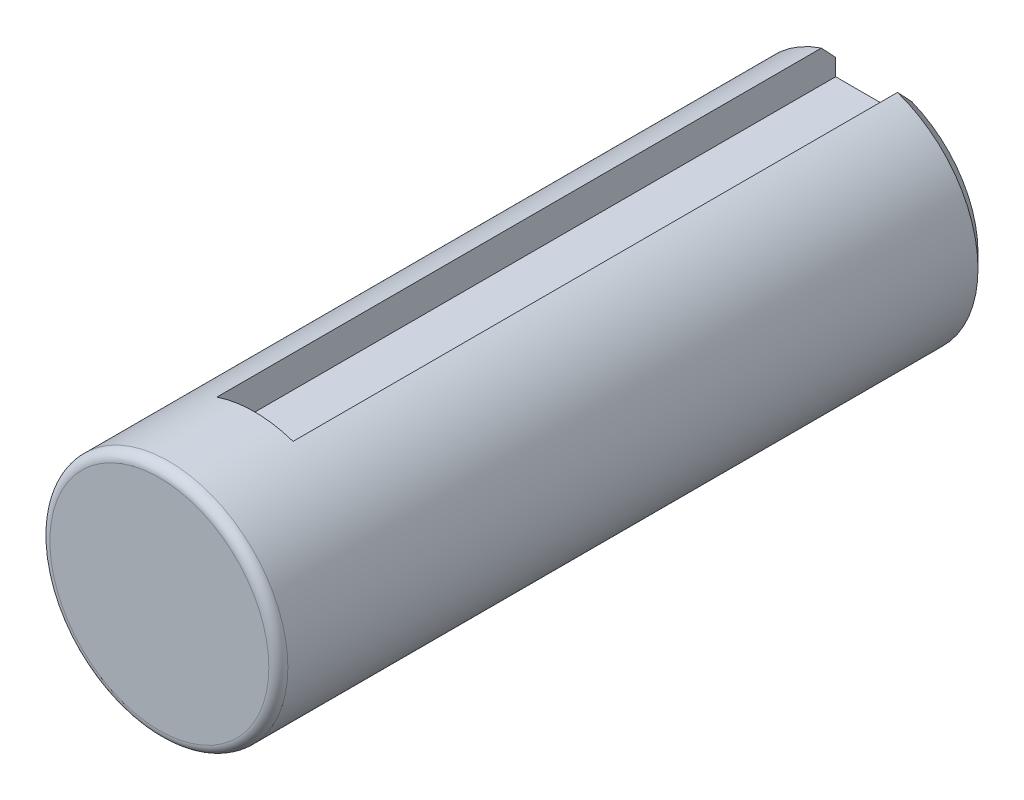
ISO-10303-21;
HEADER;
FILE_DESCRIPTION(('STEP AP214'),'2;1');
FILE_NAME('part.step','',(''),(''),'','','');
FILE_SCHEMA(('AUTOMOTIVE_DESIGN { 1 0 10303 214 1 1 1 1 }'));
ENDSEC;
DATA;
#1=APPLICATION_CONTEXT('core data for automotive mechanical design processes');
#2=APPLICATION_PROTOCOL_DEFINITION('international standard','automotive_design',2000,#1);
#3=PRODUCT_CONTEXT('',#1,'mechanical');
#4=PRODUCT('Part','Part','',(#3));
#5=PRODUCT_RELATED_PRODUCT_CATEGORY('part','',(#4));
#6=PRODUCT_DEFINITION_FORMATION('','',#4);
#7=PRODUCT_DEFINITION_CONTEXT('part definition',#1,'design');
#8=PRODUCT_DEFINITION('design','',#6,#7);
#9=PRODUCT_DEFINITION_SHAPE('','',#8);
#10=(LENGTH_UNIT() NAMED_UNIT(*) SI_UNIT(.MILLI.,.METRE.));
#11=(NAMED_UNIT(*) PLANE_ANGLE_UNIT() SI_UNIT($,.RADIAN.));
#12=(NAMED_UNIT(*) SI_UNIT($,.STERADIAN.) SOLID_ANGLE_UNIT());
#13=UNCERTAINTY_MEASURE_WITH_UNIT(LENGTH_MEASURE(1.E-05),#10,'distance_accuracy_value','');
#14=(GEOMETRIC_REPRESENTATION_CONTEXT(3) GLOBAL_UNCERTAINTY_ASSIGNED_CONTEXT((#13)) GLOBAL_UNIT_ASSIGNED_CONTEXT((#10,
#11,#12)) REPRESENTATION_CONTEXT('',''));
#15=CARTESIAN_POINT('',(0.,0.,0.));
#16=DIRECTION('',(0.,0.,1.));
#17=DIRECTION('',(1.,0.,0.));
#18=AXIS2_PLACEMENT_3D('',#15,#16,#17);
#19=CARTESIAN_POINT('',(0.,0.,75.));
#20=DIRECTION('',(0.,0.,-1.));
#21=DIRECTION('',(-1.,0.,0.));
#22=AXIS2_PLACEMENT_3D('',#19,#20,#21);
#23=CYLINDRICAL_SURFACE('',#22,12.5);
#24=CARTESIAN_POINT('',(0.,0.,74.));
#25=DIRECTION('',(0.,0.,1.));
#26=DIRECTION('',(1.,0.,0.));
#27=AXIS2_PLACEMENT_3D('',#24,#25,#26);
#28=CIRCLE('',#27,12.5);
#29=CARTESIAN_POINT('',(12.5,0.,74.));
#30=VERTEX_POINT('',#29);
#31=EDGE_CURVE('E11',#30,#30,#28,.F.);
#32=ORIENTED_EDGE('',*,*,#31,.T.);
#33=EDGE_LOOP('',(#32));
#34=FACE_BOUND('',#33,.T.);
#35=DIRECTION('',(0.,0.,-1.));
#36=VECTOR('',#35,1.);
#37=CARTESIAN_POINT('',(-3.95410501543583,11.8581218380866,65.));
#38=LINE('',#37,#36);
#39=CARTESIAN_POINT('',(-3.95410501543583,11.8581218380866,65.));
#40=VERTEX_POINT('',#39);
#41=CARTESIAN_POINT('',(-3.95410501543583,11.8581218380866,1.50000000000002));
#42=VERTEX_POINT('',#41);
#43=EDGE_CURVE('E103',#40,#42,#38,.T.);
#44=ORIENTED_EDGE('',*,*,#43,.T.);
#45=CARTESIAN_POINT('',(0.,0.,1.50000000000002));
#46=DIRECTION('',(0.,0.,1.));
#47=DIRECTION('',(1.,0.,0.));
#48=AXIS2_PLACEMENT_3D('',#45,#46,#47);
#49=CIRCLE('',#48,12.5);
#50=CARTESIAN_POINT('',(4.04589498456417,11.8271185744406,1.50000000000002));
#51=VERTEX_POINT('',#50);
#52=EDGE_CURVE('E129',#42,#51,#49,.T.);
#53=ORIENTED_EDGE('',*,*,#52,.T.);
#54=DIRECTION('',(0.,0.,-1.));
#55=VECTOR('',#54,1.);
#56=CARTESIAN_POINT('',(4.04589498456417,11.8271185744406,65.));
#57=LINE('',#56,#55);
#58=CARTESIAN_POINT('',(4.04589498456417,11.8271185744406,65.));
#59=VERTEX_POINT('',#58);
#60=EDGE_CURVE('E111',#59,#51,#57,.T.);
#61=ORIENTED_EDGE('',*,*,#60,.F.);
#62=CARTESIAN_POINT('',(0.,0.,65.));
#63=DIRECTION('',(0.,0.,-1.));
#64=DIRECTION('',(-1.,0.,0.));
#65=AXIS2_PLACEMENT_3D('',#62,#63,#64);
#66=CIRCLE('',#65,12.5);
#67=EDGE_CURVE('E96',#40,#59,#66,.T.);
#68=ORIENTED_EDGE('',*,*,#67,.F.);
#69=EDGE_LOOP('',(#44,#53,#61,#68));
#70=FACE_BOUND('',#69,.T.);
#71=ADVANCED_FACE('F39',(#34,#70),#23,.T.);
#72=CARTESIAN_POINT('',(0.,0.,75.));
#73=DIRECTION('',(0.,0.,1.));
#74=DIRECTION('',(1.,0.,0.));
#75=AXIS2_PLACEMENT_3D('',#72,#73,#74);
#76=PLANE('',#75);
#77=CARTESIAN_POINT('',(0.,0.,75.));
#78=DIRECTION('',(0.,0.,1.));
#79=DIRECTION('',(1.,0.,0.));
#80=AXIS2_PLACEMENT_3D('',#77,#78,#79);
#81=CIRCLE('',#80,11.5);
#82=CARTESIAN_POINT('',(11.5,0.,75.));
#83=VERTEX_POINT('',#82);
#84=EDGE_CURVE('E47',#83,#83,#81,.T.);
#85=ORIENTED_EDGE('',*,*,#84,.T.);
#86=EDGE_LOOP('',(#85));
#87=FACE_BOUND('',#86,.T.);
#88=ADVANCED_FACE('F170',(#87),#76,.T.);
#89=CARTESIAN_POINT('',(0.,0.,0.));
#90=DIRECTION('',(0.,0.,1.));
#91=DIRECTION('',(1.,0.,0.));
#92=AXIS2_PLACEMENT_3D('',#89,#90,#91);
#93=PLANE('',#92);
#94=DIRECTION('',(0.,-1.,0.));
#95=VECTOR('',#94,1.);
#96=CARTESIAN_POINT('',(4.04589498456417,0.,0.));
#97=LINE('',#96,#95);
#98=CARTESIAN_POINT('',(4.04589498456417,10.2289165493652,0.));
#99=VERTEX_POINT('',#98);
#100=CARTESIAN_POINT('',(4.04589498456417,8.5,0.));
#101=VERTEX_POINT('',#100);
#102=EDGE_CURVE('E100',#99,#101,#97,.T.);
#103=ORIENTED_EDGE('',*,*,#102,.F.);
#104=CARTESIAN_POINT('',(0.,0.,0.));
#105=DIRECTION('',(0.,0.,1.));
#106=DIRECTION('',(1.,0.,0.));
#107=AXIS2_PLACEMENT_3D('',#104,#105,#106);
#108=CIRCLE('',#107,11.);
#109=CARTESIAN_POINT('',(-3.95410501543583,10.2647480985607,0.));
#110=VERTEX_POINT('',#109);
#111=EDGE_CURVE('E141',#99,#110,#108,.F.);
#112=ORIENTED_EDGE('',*,*,#111,.T.);
#113=DIRECTION('',(0.,1.,0.));
#114=VECTOR('',#113,1.);
#115=CARTESIAN_POINT('',(-3.95410501543583,0.,0.));
#116=LINE('',#115,#114);
#117=CARTESIAN_POINT('',(-3.95410501543583,8.5,0.));
#118=VERTEX_POINT('',#117);
#119=EDGE_CURVE('E123',#118,#110,#116,.T.);
#120=ORIENTED_EDGE('',*,*,#119,.F.);
#121=DIRECTION('',(-1.,0.,0.));
#122=VECTOR('',#121,1.);
#123=CARTESIAN_POINT('',(0.,8.5,0.));
#124=LINE('',#123,#122);
#125=EDGE_CURVE('E120',#101,#118,#124,.T.);
#126=ORIENTED_EDGE('',*,*,#125,.F.);
#127=EDGE_LOOP('',(#103,#112,#120,#126));
#128=FACE_BOUND('',#127,.T.);
#129=ADVANCED_FACE('F185',(#128),#93,.F.);
#130=CARTESIAN_POINT('',(0.,8.5,65.));
#131=DIRECTION('',(0.,-1.,0.));
#132=DIRECTION('',(0.,0.,-1.));
#133=AXIS2_PLACEMENT_3D('',#130,#131,#132);
#134=PLANE('',#133);
#135=DIRECTION('',(0.,0.,-1.));
#136=VECTOR('',#135,1.);
#137=CARTESIAN_POINT('',(-3.95410501543583,8.5,65.));
#138=LINE('',#137,#136);
#139=CARTESIAN_POINT('',(-3.95410501543583,8.5,62.));
#140=VERTEX_POINT('',#139);
#141=EDGE_CURVE('E112',#140,#118,#138,.T.);
#142=ORIENTED_EDGE('',*,*,#141,.F.);
#143=DIRECTION('',(-1.,0.,0.));
#144=VECTOR('',#143,1.);
#145=CARTESIAN_POINT('',(0.,8.5,62.));
#146=LINE('',#145,#144);
#147=CARTESIAN_POINT('',(4.04589498456417,8.5,62.));
#148=VERTEX_POINT('',#147);
#149=EDGE_CURVE('E54',#140,#148,#146,.F.);
#150=ORIENTED_EDGE('',*,*,#149,.T.);
#151=DIRECTION('',(0.,0.,-1.));
#152=VECTOR('',#151,1.);
#153=CARTESIAN_POINT('',(4.04589498456417,8.5,65.));
#154=LINE('',#153,#152);
#155=EDGE_CURVE('E127',#148,#101,#154,.T.);
#156=ORIENTED_EDGE('',*,*,#155,.T.);
#157=ORIENTED_EDGE('',*,*,#125,.T.);
#158=EDGE_LOOP('',(#142,#150,#156,#157));
#159=FACE_BOUND('',#158,.T.);
#160=ADVANCED_FACE('F152',(#159),#134,.F.);
#161=CARTESIAN_POINT('',(4.04589498456417,0.,65.));
#162=DIRECTION('',(1.,0.,0.));
#163=DIRECTION('',(0.,0.,-1.));
#164=AXIS2_PLACEMENT_3D('',#161,#162,#163);
#165=PLANE('',#164);
#166=ORIENTED_EDGE('',*,*,#155,.F.);
#167=CARTESIAN_POINT('',(4.04589498456417,11.5,62.));
#168=DIRECTION('',(1.,0.,0.));
#169=DIRECTION('',(0.,0.,-1.));
#170=AXIS2_PLACEMENT_3D('',#167,#168,#169);
#171=CIRCLE('',#170,3.);
#172=CARTESIAN_POINT('',(4.04589498456417,11.5,65.));
#173=VERTEX_POINT('',#172);
#174=EDGE_CURVE('E166',#148,#173,#171,.F.);
#175=ORIENTED_EDGE('',*,*,#174,.T.);
#176=DIRECTION('',(0.,-1.,0.));
#177=VECTOR('',#176,1.);
#178=CARTESIAN_POINT('',(4.04589498456417,0.,65.));
#179=LINE('',#178,#177);
#180=EDGE_CURVE('E116',#59,#173,#179,.T.);
#181=ORIENTED_EDGE('',*,*,#180,.F.);
#182=ORIENTED_EDGE('',*,*,#60,.T.);
#183=CARTESIAN_POINT('',(4.04589498456417,11.8271185744406,1.50000000000002));
#184=CARTESIAN_POINT('',(4.04589498456417,11.6944391646941,1.37446380034424));
#185=CARTESIAN_POINT('',(4.04589498456417,11.5616502235388,1.24904326571793));
#186=CARTESIAN_POINT('',(4.04589498456417,11.2958297238162,0.998460821250919));
#187=CARTESIAN_POINT('',(4.04589498456417,11.1627981663785,0.873298910211803));
#188=CARTESIAN_POINT('',(4.04589498456417,10.8964675372954,0.623259737593793));
#189=CARTESIAN_POINT('',(4.04589498456417,10.7631684654286,0.49838247625068));
#190=CARTESIAN_POINT('',(4.04589498456417,10.4962728350549,0.24894504397377));
#191=CARTESIAN_POINT('',(4.04589498456417,10.3626762751685,0.124384874516151));
#192=CARTESIAN_POINT('',(4.04589498456417,10.2289165493652,0.));
#193=B_SPLINE_CURVE_WITH_KNOTS('',3,(#183,#184,#185,#186,#187,#188,#189,#190,#191,#192),
.UNSPECIFIED.,.F.,.F.,(4,2,2,2,4),(0.,0.547967607770983,1.09593267065581,1.64389818726585,
2.19186625020638),.UNSPECIFIED.);
#194=EDGE_CURVE('E133',#51,#99,#193,.T.);
#195=ORIENTED_EDGE('',*,*,#194,.T.);
#196=ORIENTED_EDGE('',*,*,#102,.T.);
#197=EDGE_LOOP('',(#166,#175,#181,#182,#195,#196));
#198=FACE_BOUND('',#197,.T.);
#199=ADVANCED_FACE('F147',(#198),#165,.F.);
#200=CARTESIAN_POINT('',(-3.95410501543583,0.,65.));
#201=DIRECTION('',(-1.,0.,0.));
#202=DIRECTION('',(0.,0.,1.));
#203=AXIS2_PLACEMENT_3D('',#200,#201,#202);
#204=PLANE('',#203);
#205=DIRECTION('',(0.,1.,0.));
#206=VECTOR('',#205,1.);
#207=CARTESIAN_POINT('',(-3.95410501543583,0.,65.));
#208=LINE('',#207,#206);
#209=CARTESIAN_POINT('',(-3.95410501543583,11.5,65.));
#210=VERTEX_POINT('',#209);
#211=EDGE_CURVE('E91',#210,#40,#208,.T.);
#212=ORIENTED_EDGE('',*,*,#211,.F.);
#213=CARTESIAN_POINT('',(-3.95410501543583,11.5,62.));
#214=DIRECTION('',(-1.,0.,0.));
#215=DIRECTION('',(0.,0.,1.));
#216=AXIS2_PLACEMENT_3D('',#213,#214,#215);
#217=CIRCLE('',#216,3.);
#218=EDGE_CURVE('E62',#210,#140,#217,.F.);
#219=ORIENTED_EDGE('',*,*,#218,.T.);
#220=ORIENTED_EDGE('',*,*,#141,.T.);
#221=ORIENTED_EDGE('',*,*,#119,.T.);
#222=CARTESIAN_POINT('',(-3.95410501543583,10.2647480985607,0.));
#223=CARTESIAN_POINT('',(-3.95410501543583,10.3980763059639,0.124417825688046));
#224=CARTESIAN_POINT('',(-3.95410501543583,10.5312496295546,0.249001476357351));
#225=CARTESIAN_POINT('',(-3.95410501543583,10.7973138777557,0.4984688704094));
#226=CARTESIAN_POINT('',(-3.95410501543583,10.9302048035469,0.623352612532694));
#227=CARTESIAN_POINT('',(-3.95410501543583,11.1957326424724,0.873389582025686));
#228=CARTESIAN_POINT('',(-3.95410501543583,11.328369555796,0.998542809194296));
#229=CARTESIAN_POINT('',(-3.95410501543583,11.5934129399509,1.24909416173859));
#230=CARTESIAN_POINT('',(-3.95410501543583,11.7258194098149,1.37449228813754));
#231=CARTESIAN_POINT('',(-3.95410501543583,11.8581218380866,1.50000000000002));
#232=B_SPLINE_CURVE_WITH_KNOTS('',3,(#222,#223,#224,#225,#226,#227,#228,#229,#230,#231),
.UNSPECIFIED.,.F.,.F.,(4,2,2,2,4),(0.,0.547088237275371,1.09417418247947,1.64125971959375,
2.18834754748817),.UNSPECIFIED.);
#233=EDGE_CURVE('E107',#110,#42,#232,.T.);
#234=ORIENTED_EDGE('',*,*,#233,.T.);
#235=ORIENTED_EDGE('',*,*,#43,.F.);
#236=EDGE_LOOP('',(#212,#219,#220,#221,#234,#235));
#237=FACE_BOUND('',#236,.T.);
#238=ADVANCED_FACE('F104',(#237),#204,.F.);
#239=CARTESIAN_POINT('',(0.,0.,65.));
#240=DIRECTION('',(0.,0.,-1.));
#241=DIRECTION('',(-1.,0.,0.));
#242=AXIS2_PLACEMENT_3D('',#239,#240,#241);
#243=PLANE('',#242);
#244=ORIENTED_EDGE('',*,*,#180,.T.);
#245=DIRECTION('',(-1.,0.,0.));
#246=VECTOR('',#245,1.);
#247=CARTESIAN_POINT('',(0.,11.5,65.));
#248=LINE('',#247,#246);
#249=EDGE_CURVE('E99',#173,#210,#248,.T.);
#250=ORIENTED_EDGE('',*,*,#249,.T.);
#251=ORIENTED_EDGE('',*,*,#211,.T.);
#252=ORIENTED_EDGE('',*,*,#67,.T.);
#253=EDGE_LOOP('',(#244,#250,#251,#252));
#254=FACE_BOUND('',#253,.T.);
#255=ADVANCED_FACE('F94',(#254),#243,.T.);
#256=CARTESIAN_POINT('',(0.,0.,1.50000000000002));
#257=DIRECTION('',(0.,0.,1.));
#258=DIRECTION('',(1.,0.,0.));
#259=AXIS2_PLACEMENT_3D('',#256,#257,#258);
#260=CONICAL_SURFACE('',#259,12.5,0.78539816339745);
#261=ORIENTED_EDGE('',*,*,#233,.F.);
#262=ORIENTED_EDGE('',*,*,#111,.F.);
#263=ORIENTED_EDGE('',*,*,#194,.F.);
#264=ORIENTED_EDGE('',*,*,#52,.F.);
#265=EDGE_LOOP('',(#261,#262,#263,#264));
#266=FACE_BOUND('',#265,.T.);
#267=ADVANCED_FACE('F144',(#266),#260,.T.);
#268=CARTESIAN_POINT('',(0.,11.5,62.));
#269=DIRECTION('',(-1.,0.,0.));
#270=DIRECTION('',(0.,0.,1.));
#271=AXIS2_PLACEMENT_3D('',#268,#269,#270);
#272=CYLINDRICAL_SURFACE('',#271,3.);
#273=ORIENTED_EDGE('',*,*,#174,.F.);
#274=ORIENTED_EDGE('',*,*,#149,.F.);
#275=ORIENTED_EDGE('',*,*,#218,.F.);
#276=ORIENTED_EDGE('',*,*,#249,.F.);
#277=EDGE_LOOP('',(#273,#274,#275,#276));
#278=FACE_BOUND('',#277,.T.);
#279=ADVANCED_FACE('F173',(#278),#272,.F.);
#280=CARTESIAN_POINT('',(0.,0.,74.));
#281=DIRECTION('',(0.,0.,1.));
#282=DIRECTION('',(1.,0.,0.));
#283=AXIS2_PLACEMENT_3D('',#280,#281,#282);
#284=TOROIDAL_SURFACE('',#283,11.5,1.);
#285=ORIENTED_EDGE('',*,*,#31,.F.);
#286=EDGE_LOOP('',(#285));
#287=FACE_BOUND('',#286,.T.);
#288=ORIENTED_EDGE('',*,*,#84,.F.);
#289=EDGE_LOOP('',(#288));
#290=FACE_BOUND('',#289,.T.);
#291=ADVANCED_FACE('F41',(#287,#290),#284,.T.);
#292=CLOSED_SHELL('',(#71,#88,#129,#160,#199,#238,#255,#267,#279,#291));
#293=MANIFOLD_SOLID_BREP('B2',#292);
#294=ADVANCED_BREP_SHAPE_REPRESENTATION('',(#18,#293),#14);
#295=SHAPE_DEFINITION_REPRESENTATION(#9,#294);
ENDSEC;
END-ISO-10303-21;
